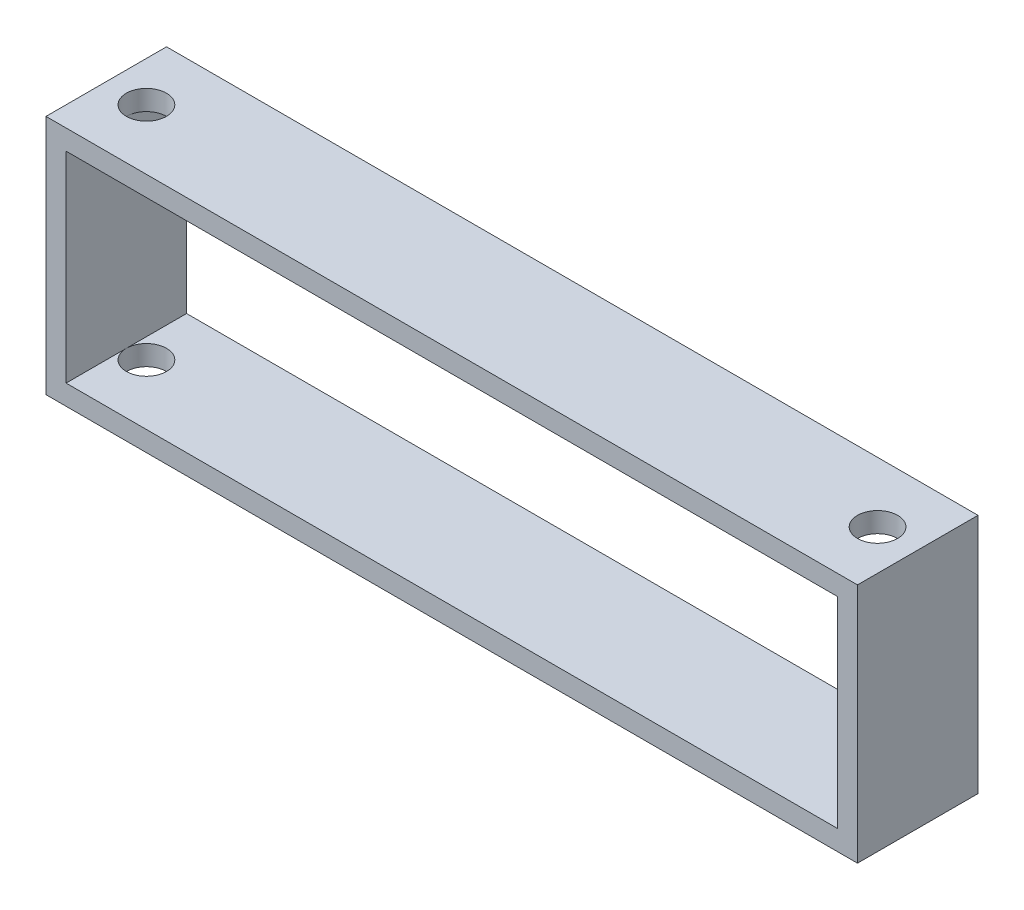
ISO-10303-21;
HEADER;
FILE_DESCRIPTION(('STEP AP214'),'2;1');
FILE_NAME('part.step','',(''),(''),'','','');
FILE_SCHEMA(('AUTOMOTIVE_DESIGN { 1 0 10303 214 1 1 1 1 }'));
ENDSEC;
DATA;
#1=APPLICATION_CONTEXT('core data for automotive mechanical design processes');
#2=APPLICATION_PROTOCOL_DEFINITION('international standard','automotive_design',2000,#1);
#3=PRODUCT_CONTEXT('',#1,'mechanical');
#4=PRODUCT('Part','Part','',(#3));
#5=PRODUCT_RELATED_PRODUCT_CATEGORY('part','',(#4));
#6=PRODUCT_DEFINITION_FORMATION('','',#4);
#7=PRODUCT_DEFINITION_CONTEXT('part definition',#1,'design');
#8=PRODUCT_DEFINITION('design','',#6,#7);
#9=PRODUCT_DEFINITION_SHAPE('','',#8);
#10=(LENGTH_UNIT() NAMED_UNIT(*) SI_UNIT(.MILLI.,.METRE.));
#11=(NAMED_UNIT(*) PLANE_ANGLE_UNIT() SI_UNIT($,.RADIAN.));
#12=(NAMED_UNIT(*) SI_UNIT($,.STERADIAN.) SOLID_ANGLE_UNIT());
#13=UNCERTAINTY_MEASURE_WITH_UNIT(LENGTH_MEASURE(1.E-05),#10,'distance_accuracy_value','');
#14=(GEOMETRIC_REPRESENTATION_CONTEXT(3) GLOBAL_UNCERTAINTY_ASSIGNED_CONTEXT((#13)) GLOBAL_UNIT_ASSIGNED_CONTEXT((#10,
#11,#12)) REPRESENTATION_CONTEXT('',''));
#15=CARTESIAN_POINT('',(0.,0.,0.));
#16=DIRECTION('',(0.,0.,1.));
#17=DIRECTION('',(1.,0.,0.));
#18=AXIS2_PLACEMENT_3D('',#15,#16,#17);
#19=CARTESIAN_POINT('',(-37.062063557265,60.,-4.0983606557377));
#20=DIRECTION('',(0.,-1.,0.));
#21=DIRECTION('',(0.,0.,-1.));
#22=AXIS2_PLACEMENT_3D('',#19,#20,#21);
#23=CYLINDRICAL_SURFACE('',#22,5.);
#24=CARTESIAN_POINT('',(-37.062063557265,55.,-4.0983606557377));
#25=DIRECTION('',(0.,1.,0.));
#26=DIRECTION('',(0.,0.,1.));
#27=AXIS2_PLACEMENT_3D('',#24,#25,#26);
#28=CIRCLE('',#27,5.);
#29=CARTESIAN_POINT('',(-42.062063557265,55.,-4.0983606557377));
#30=VERTEX_POINT('',#29);
#31=EDGE_CURVE('E157',#30,#30,#28,.T.);
#32=ORIENTED_EDGE('',*,*,#31,.F.);
#33=EDGE_LOOP('',(#32));
#34=FACE_BOUND('',#33,.T.);
#35=CARTESIAN_POINT('',(-37.062063557265,60.,-4.0983606557377));
#36=DIRECTION('',(0.,1.,0.));
#37=DIRECTION('',(0.,0.,1.));
#38=AXIS2_PLACEMENT_3D('',#35,#36,#37);
#39=CIRCLE('',#38,5.);
#40=CARTESIAN_POINT('',(-37.062063557265,60.,0.901639344262295));
#41=VERTEX_POINT('',#40);
#42=EDGE_CURVE('E167',#41,#41,#39,.T.);
#43=ORIENTED_EDGE('',*,*,#42,.T.);
#44=EDGE_LOOP('',(#43));
#45=FACE_BOUND('',#44,.T.);
#46=ADVANCED_FACE('F36',(#34,#45),#23,.F.);
#47=CARTESIAN_POINT('',(144.937936442735,60.,-4.0983606557377));
#48=DIRECTION('',(0.,-1.,0.));
#49=DIRECTION('',(0.,0.,-1.));
#50=AXIS2_PLACEMENT_3D('',#47,#48,#49);
#51=CYLINDRICAL_SURFACE('',#50,5.00000000000002);
#52=CARTESIAN_POINT('',(144.937936442735,55.,-4.0983606557377));
#53=DIRECTION('',(0.,1.,0.));
#54=DIRECTION('',(0.,0.,1.));
#55=AXIS2_PLACEMENT_3D('',#52,#53,#54);
#56=CIRCLE('',#55,5.00000000000002);
#57=CARTESIAN_POINT('',(149.937936442735,55.,-4.0983606557377));
#58=VERTEX_POINT('',#57);
#59=EDGE_CURVE('E11',#58,#58,#56,.T.);
#60=ORIENTED_EDGE('',*,*,#59,.F.);
#61=EDGE_LOOP('',(#60));
#62=FACE_BOUND('',#61,.T.);
#63=CARTESIAN_POINT('',(144.937936442735,60.,-4.0983606557377));
#64=DIRECTION('',(0.,1.,0.));
#65=DIRECTION('',(0.,0.,1.));
#66=AXIS2_PLACEMENT_3D('',#63,#64,#65);
#67=CIRCLE('',#66,5.00000000000002);
#68=CARTESIAN_POINT('',(144.937936442735,60.,0.901639344262315));
#69=VERTEX_POINT('',#68);
#70=EDGE_CURVE('E161',#69,#69,#67,.T.);
#71=ORIENTED_EDGE('',*,*,#70,.T.);
#72=EDGE_LOOP('',(#71));
#73=FACE_BOUND('',#72,.T.);
#74=ADVANCED_FACE('F209',(#62,#73),#51,.F.);
#75=CARTESIAN_POINT('',(0.,60.,0.));
#76=DIRECTION('',(0.,-1.,0.));
#77=DIRECTION('',(0.,0.,-1.));
#78=AXIS2_PLACEMENT_3D('',#75,#76,#77);
#79=PLANE('',#78);
#80=DIRECTION('',(0.,0.,1.));
#81=VECTOR('',#80,1.);
#82=CARTESIAN_POINT('',(-47.062063557265,60.,10.9016393442623));
#83=LINE('',#82,#81);
#84=CARTESIAN_POINT('',(-47.062063557265,60.,-19.0983606557377));
#85=VERTEX_POINT('',#84);
#86=CARTESIAN_POINT('',(-47.062063557265,60.,10.9016393442623));
#87=VERTEX_POINT('',#86);
#88=EDGE_CURVE('E173',#85,#87,#83,.T.);
#89=ORIENTED_EDGE('',*,*,#88,.T.);
#90=DIRECTION('',(1.,0.,0.));
#91=VECTOR('',#90,1.);
#92=CARTESIAN_POINT('',(-47.062063557265,60.,10.9016393442623));
#93=LINE('',#92,#91);
#94=CARTESIAN_POINT('',(154.937936442735,60.,10.9016393442623));
#95=VERTEX_POINT('',#94);
#96=EDGE_CURVE('E176',#87,#95,#93,.T.);
#97=ORIENTED_EDGE('',*,*,#96,.T.);
#98=DIRECTION('',(0.,0.,-1.));
#99=VECTOR('',#98,1.);
#100=CARTESIAN_POINT('',(154.937936442735,60.,10.9016393442623));
#101=LINE('',#100,#99);
#102=CARTESIAN_POINT('',(154.937936442735,60.,-19.0983606557377));
#103=VERTEX_POINT('',#102);
#104=EDGE_CURVE('E179',#95,#103,#101,.T.);
#105=ORIENTED_EDGE('',*,*,#104,.T.);
#106=DIRECTION('',(-1.,0.,0.));
#107=VECTOR('',#106,1.);
#108=CARTESIAN_POINT('',(-47.062063557265,60.,-19.0983606557377));
#109=LINE('',#108,#107);
#110=EDGE_CURVE('E181',#103,#85,#109,.T.);
#111=ORIENTED_EDGE('',*,*,#110,.T.);
#112=EDGE_LOOP('',(#89,#97,#105,#111));
#113=FACE_BOUND('',#112,.T.);
#114=ORIENTED_EDGE('',*,*,#42,.F.);
#115=EDGE_LOOP('',(#114));
#116=FACE_BOUND('',#115,.T.);
#117=ORIENTED_EDGE('',*,*,#70,.F.);
#118=EDGE_LOOP('',(#117));
#119=FACE_BOUND('',#118,.T.);
#120=ADVANCED_FACE('F214',(#113,#116,#119),#79,.F.);
#121=CARTESIAN_POINT('',(0.,0.,0.));
#122=DIRECTION('',(0.,-1.,0.));
#123=DIRECTION('',(0.,0.,-1.));
#124=AXIS2_PLACEMENT_3D('',#121,#122,#123);
#125=PLANE('',#124);
#126=CARTESIAN_POINT('',(-37.062063557265,0.,-4.0983606557377));
#127=DIRECTION('',(0.,1.,0.));
#128=DIRECTION('',(0.,0.,1.));
#129=AXIS2_PLACEMENT_3D('',#126,#127,#128);
#130=CIRCLE('',#129,5.);
#131=CARTESIAN_POINT('',(-37.062063557265,0.,0.901639344262295));
#132=VERTEX_POINT('',#131);
#133=EDGE_CURVE('E164',#132,#132,#130,.T.);
#134=ORIENTED_EDGE('',*,*,#133,.T.);
#135=EDGE_LOOP('',(#134));
#136=FACE_BOUND('',#135,.T.);
#137=DIRECTION('',(0.,0.,1.));
#138=VECTOR('',#137,1.);
#139=CARTESIAN_POINT('',(-47.062063557265,0.,10.9016393442623));
#140=LINE('',#139,#138);
#141=CARTESIAN_POINT('',(-47.062063557265,0.,-19.0983606557377));
#142=VERTEX_POINT('',#141);
#143=CARTESIAN_POINT('',(-47.062063557265,0.,10.9016393442623));
#144=VERTEX_POINT('',#143);
#145=EDGE_CURVE('E170',#142,#144,#140,.T.);
#146=ORIENTED_EDGE('',*,*,#145,.F.);
#147=DIRECTION('',(-1.,0.,0.));
#148=VECTOR('',#147,1.);
#149=CARTESIAN_POINT('',(-47.062063557265,0.,-19.0983606557377));
#150=LINE('',#149,#148);
#151=CARTESIAN_POINT('',(154.937936442735,0.,-19.0983606557377));
#152=VERTEX_POINT('',#151);
#153=EDGE_CURVE('E177',#152,#142,#150,.T.);
#154=ORIENTED_EDGE('',*,*,#153,.F.);
#155=DIRECTION('',(0.,0.,-1.));
#156=VECTOR('',#155,1.);
#157=CARTESIAN_POINT('',(154.937936442735,0.,10.9016393442623));
#158=LINE('',#157,#156);
#159=CARTESIAN_POINT('',(154.937936442735,0.,10.9016393442623));
#160=VERTEX_POINT('',#159);
#161=EDGE_CURVE('E188',#160,#152,#158,.T.);
#162=ORIENTED_EDGE('',*,*,#161,.F.);
#163=DIRECTION('',(1.,0.,0.));
#164=VECTOR('',#163,1.);
#165=CARTESIAN_POINT('',(-47.062063557265,0.,10.9016393442623));
#166=LINE('',#165,#164);
#167=EDGE_CURVE('E186',#144,#160,#166,.T.);
#168=ORIENTED_EDGE('',*,*,#167,.F.);
#169=EDGE_LOOP('',(#146,#154,#162,#168));
#170=FACE_BOUND('',#169,.T.);
#171=CARTESIAN_POINT('',(144.937936442735,0.,-4.0983606557377));
#172=DIRECTION('',(0.,1.,0.));
#173=DIRECTION('',(0.,0.,1.));
#174=AXIS2_PLACEMENT_3D('',#171,#172,#173);
#175=CIRCLE('',#174,5.00000000000002);
#176=CARTESIAN_POINT('',(144.937936442735,0.,0.901639344262315));
#177=VERTEX_POINT('',#176);
#178=EDGE_CURVE('E160',#177,#177,#175,.T.);
#179=ORIENTED_EDGE('',*,*,#178,.T.);
#180=EDGE_LOOP('',(#179));
#181=FACE_BOUND('',#180,.T.);
#182=ADVANCED_FACE('F212',(#136,#170,#181),#125,.T.);
#183=CARTESIAN_POINT('',(-47.062063557265,60.,10.9016393442623));
#184=DIRECTION('',(1.,0.,0.));
#185=DIRECTION('',(0.,0.,-1.));
#186=AXIS2_PLACEMENT_3D('',#183,#184,#185);
#187=PLANE('',#186);
#188=ORIENTED_EDGE('',*,*,#145,.T.);
#189=DIRECTION('',(0.,-1.,0.));
#190=VECTOR('',#189,1.);
#191=CARTESIAN_POINT('',(-47.062063557265,60.,10.9016393442623));
#192=LINE('',#191,#190);
#193=EDGE_CURVE('E199',#87,#144,#192,.T.);
#194=ORIENTED_EDGE('',*,*,#193,.F.);
#195=ORIENTED_EDGE('',*,*,#88,.F.);
#196=DIRECTION('',(0.,-1.,0.));
#197=VECTOR('',#196,1.);
#198=CARTESIAN_POINT('',(-47.062063557265,60.,-19.0983606557377));
#199=LINE('',#198,#197);
#200=EDGE_CURVE('E183',#85,#142,#199,.T.);
#201=ORIENTED_EDGE('',*,*,#200,.T.);
#202=EDGE_LOOP('',(#188,#194,#195,#201));
#203=FACE_BOUND('',#202,.T.);
#204=ADVANCED_FACE('F38',(#203),#187,.F.);
#205=CARTESIAN_POINT('',(-47.062063557265,60.,10.9016393442623));
#206=DIRECTION('',(0.,0.,-1.));
#207=DIRECTION('',(-1.,0.,0.));
#208=AXIS2_PLACEMENT_3D('',#205,#206,#207);
#209=PLANE('',#208);
#210=DIRECTION('',(1.,0.,0.));
#211=VECTOR('',#210,1.);
#212=CARTESIAN_POINT('',(-42.062063557265,5.,10.9016393442623));
#213=LINE('',#212,#211);
#214=CARTESIAN_POINT('',(-42.062063557265,5.,10.9016393442623));
#215=VERTEX_POINT('',#214);
#216=CARTESIAN_POINT('',(149.937936442735,5.,10.9016393442623));
#217=VERTEX_POINT('',#216);
#218=EDGE_CURVE('E143',#215,#217,#213,.T.);
#219=ORIENTED_EDGE('',*,*,#218,.F.);
#220=DIRECTION('',(0.,-1.,0.));
#221=VECTOR('',#220,1.);
#222=CARTESIAN_POINT('',(-42.062063557265,55.,10.9016393442623));
#223=LINE('',#222,#221);
#224=CARTESIAN_POINT('',(-42.062063557265,55.,10.9016393442623));
#225=VERTEX_POINT('',#224);
#226=EDGE_CURVE('E51',#225,#215,#223,.T.);
#227=ORIENTED_EDGE('',*,*,#226,.F.);
#228=DIRECTION('',(-1.,0.,0.));
#229=VECTOR('',#228,1.);
#230=CARTESIAN_POINT('',(-42.062063557265,55.,10.9016393442623));
#231=LINE('',#230,#229);
#232=CARTESIAN_POINT('',(149.937936442735,55.,10.9016393442623));
#233=VERTEX_POINT('',#232);
#234=EDGE_CURVE('E134',#233,#225,#231,.T.);
#235=ORIENTED_EDGE('',*,*,#234,.F.);
#236=DIRECTION('',(0.,1.,0.));
#237=VECTOR('',#236,1.);
#238=CARTESIAN_POINT('',(149.937936442735,55.,10.9016393442623));
#239=LINE('',#238,#237);
#240=EDGE_CURVE('E137',#217,#233,#239,.T.);
#241=ORIENTED_EDGE('',*,*,#240,.F.);
#242=EDGE_LOOP('',(#219,#227,#235,#241));
#243=FACE_BOUND('',#242,.T.);
#244=ORIENTED_EDGE('',*,*,#167,.T.);
#245=DIRECTION('',(0.,-1.,0.));
#246=VECTOR('',#245,1.);
#247=CARTESIAN_POINT('',(154.937936442735,60.,10.9016393442623));
#248=LINE('',#247,#246);
#249=EDGE_CURVE('E196',#95,#160,#248,.T.);
#250=ORIENTED_EDGE('',*,*,#249,.F.);
#251=ORIENTED_EDGE('',*,*,#96,.F.);
#252=ORIENTED_EDGE('',*,*,#193,.T.);
#253=EDGE_LOOP('',(#244,#250,#251,#252));
#254=FACE_BOUND('',#253,.T.);
#255=ADVANCED_FACE('F221',(#243,#254),#209,.F.);
#256=CARTESIAN_POINT('',(154.937936442735,60.,10.9016393442623));
#257=DIRECTION('',(-1.,0.,0.));
#258=DIRECTION('',(0.,0.,1.));
#259=AXIS2_PLACEMENT_3D('',#256,#257,#258);
#260=PLANE('',#259);
#261=ORIENTED_EDGE('',*,*,#161,.T.);
#262=DIRECTION('',(0.,-1.,0.));
#263=VECTOR('',#262,1.);
#264=CARTESIAN_POINT('',(154.937936442735,60.,-19.0983606557377));
#265=LINE('',#264,#263);
#266=EDGE_CURVE('E193',#103,#152,#265,.T.);
#267=ORIENTED_EDGE('',*,*,#266,.F.);
#268=ORIENTED_EDGE('',*,*,#104,.F.);
#269=ORIENTED_EDGE('',*,*,#249,.T.);
#270=EDGE_LOOP('',(#261,#267,#268,#269));
#271=FACE_BOUND('',#270,.T.);
#272=ADVANCED_FACE('F241',(#271),#260,.F.);
#273=CARTESIAN_POINT('',(-47.062063557265,60.,-19.0983606557377));
#274=DIRECTION('',(0.,0.,1.));
#275=DIRECTION('',(1.,0.,0.));
#276=AXIS2_PLACEMENT_3D('',#273,#274,#275);
#277=PLANE('',#276);
#278=DIRECTION('',(-1.,0.,0.));
#279=VECTOR('',#278,1.);
#280=CARTESIAN_POINT('',(-42.062063557265,55.,-19.0983606557377));
#281=LINE('',#280,#279);
#282=CARTESIAN_POINT('',(149.937936442735,55.,-19.0983606557377));
#283=VERTEX_POINT('',#282);
#284=CARTESIAN_POINT('',(-42.062063557265,55.,-19.0983606557377));
#285=VERTEX_POINT('',#284);
#286=EDGE_CURVE('E133',#283,#285,#281,.T.);
#287=ORIENTED_EDGE('',*,*,#286,.T.);
#288=DIRECTION('',(0.,-1.,0.));
#289=VECTOR('',#288,1.);
#290=CARTESIAN_POINT('',(-42.062063557265,55.,-19.0983606557377));
#291=LINE('',#290,#289);
#292=CARTESIAN_POINT('',(-42.062063557265,5.,-19.0983606557377));
#293=VERTEX_POINT('',#292);
#294=EDGE_CURVE('E116',#285,#293,#291,.T.);
#295=ORIENTED_EDGE('',*,*,#294,.T.);
#296=DIRECTION('',(1.,0.,0.));
#297=VECTOR('',#296,1.);
#298=CARTESIAN_POINT('',(-42.062063557265,5.,-19.0983606557377));
#299=LINE('',#298,#297);
#300=CARTESIAN_POINT('',(149.937936442735,5.,-19.0983606557377));
#301=VERTEX_POINT('',#300);
#302=EDGE_CURVE('E124',#293,#301,#299,.T.);
#303=ORIENTED_EDGE('',*,*,#302,.T.);
#304=DIRECTION('',(0.,1.,0.));
#305=VECTOR('',#304,1.);
#306=CARTESIAN_POINT('',(149.937936442735,55.,-19.0983606557377));
#307=LINE('',#306,#305);
#308=EDGE_CURVE('E59',#301,#283,#307,.T.);
#309=ORIENTED_EDGE('',*,*,#308,.T.);
#310=EDGE_LOOP('',(#287,#295,#303,#309));
#311=FACE_BOUND('',#310,.T.);
#312=ORIENTED_EDGE('',*,*,#153,.T.);
#313=ORIENTED_EDGE('',*,*,#200,.F.);
#314=ORIENTED_EDGE('',*,*,#110,.F.);
#315=ORIENTED_EDGE('',*,*,#266,.T.);
#316=EDGE_LOOP('',(#312,#313,#314,#315));
#317=FACE_BOUND('',#316,.T.);
#318=ADVANCED_FACE('F130',(#311,#317),#277,.F.);
#319=CARTESIAN_POINT('',(-37.062063557265,5.,-4.0983606557377));
#320=DIRECTION('',(0.,-1.,0.));
#321=DIRECTION('',(0.,0.,-1.));
#322=AXIS2_PLACEMENT_3D('',#319,#320,#321);
#323=CIRCLE('',#322,5.);
#324=CARTESIAN_POINT('',(-42.062063557265,5.,-4.0983606557377));
#325=VERTEX_POINT('',#324);
#326=EDGE_CURVE('E150',#325,#325,#323,.T.);
#327=ORIENTED_EDGE('',*,*,#326,.F.);
#328=EDGE_LOOP('',(#327));
#329=FACE_BOUND('',#328,.T.);
#330=ORIENTED_EDGE('',*,*,#133,.F.);
#331=EDGE_LOOP('',(#330));
#332=FACE_BOUND('',#331,.T.);
#333=ADVANCED_FACE('F207',(#329,#332),#23,.F.);
#334=CARTESIAN_POINT('',(144.937936442735,5.,-4.0983606557377));
#335=DIRECTION('',(0.,-1.,0.));
#336=DIRECTION('',(0.,0.,-1.));
#337=AXIS2_PLACEMENT_3D('',#334,#335,#336);
#338=CIRCLE('',#337,5.00000000000002);
#339=CARTESIAN_POINT('',(149.937936442735,5.,-4.0983606557377));
#340=VERTEX_POINT('',#339);
#341=EDGE_CURVE('E44',#340,#340,#338,.T.);
#342=ORIENTED_EDGE('',*,*,#341,.F.);
#343=EDGE_LOOP('',(#342));
#344=FACE_BOUND('',#343,.T.);
#345=ORIENTED_EDGE('',*,*,#178,.F.);
#346=EDGE_LOOP('',(#345));
#347=FACE_BOUND('',#346,.T.);
#348=ADVANCED_FACE('F204',(#344,#347),#51,.F.);
#349=CARTESIAN_POINT('',(-42.062063557265,55.,-19.0983606557377));
#350=DIRECTION('',(-1.,0.,0.));
#351=DIRECTION('',(0.,-1.,0.));
#352=AXIS2_PLACEMENT_3D('',#349,#350,#351);
#353=PLANE('',#352);
#354=DIRECTION('',(0.,0.,1.));
#355=VECTOR('',#354,1.);
#356=CARTESIAN_POINT('',(-42.062063557265,55.,-19.0983606557377));
#357=LINE('',#356,#355);
#358=EDGE_CURVE('E151',#30,#225,#357,.T.);
#359=ORIENTED_EDGE('',*,*,#358,.T.);
#360=ORIENTED_EDGE('',*,*,#226,.T.);
#361=DIRECTION('',(0.,0.,1.));
#362=VECTOR('',#361,1.);
#363=CARTESIAN_POINT('',(-42.062063557265,5.,-19.0983606557377));
#364=LINE('',#363,#362);
#365=EDGE_CURVE('E118',#325,#215,#364,.T.);
#366=ORIENTED_EDGE('',*,*,#365,.F.);
#367=EDGE_CURVE('E112',#293,#325,#364,.T.);
#368=ORIENTED_EDGE('',*,*,#367,.F.);
#369=ORIENTED_EDGE('',*,*,#294,.F.);
#370=EDGE_CURVE('E148',#285,#30,#357,.T.);
#371=ORIENTED_EDGE('',*,*,#370,.T.);
#372=EDGE_LOOP('',(#359,#360,#366,#368,#369,#371));
#373=FACE_BOUND('',#372,.T.);
#374=ADVANCED_FACE('F114',(#373),#353,.F.);
#375=CARTESIAN_POINT('',(149.937936442735,55.,-19.0983606557377));
#376=DIRECTION('',(1.,0.,0.));
#377=DIRECTION('',(0.,0.,-1.));
#378=AXIS2_PLACEMENT_3D('',#375,#376,#377);
#379=PLANE('',#378);
#380=DIRECTION('',(0.,0.,1.));
#381=VECTOR('',#380,1.);
#382=CARTESIAN_POINT('',(149.937936442735,55.,-19.0983606557377));
#383=LINE('',#382,#381);
#384=EDGE_CURVE('E152',#283,#58,#383,.T.);
#385=ORIENTED_EDGE('',*,*,#384,.F.);
#386=ORIENTED_EDGE('',*,*,#308,.F.);
#387=DIRECTION('',(0.,0.,1.));
#388=VECTOR('',#387,1.);
#389=CARTESIAN_POINT('',(149.937936442735,5.,-19.0983606557377));
#390=LINE('',#389,#388);
#391=EDGE_CURVE('E127',#301,#340,#390,.T.);
#392=ORIENTED_EDGE('',*,*,#391,.T.);
#393=EDGE_CURVE('E121',#340,#217,#390,.T.);
#394=ORIENTED_EDGE('',*,*,#393,.T.);
#395=ORIENTED_EDGE('',*,*,#240,.T.);
#396=EDGE_CURVE('E154',#58,#233,#383,.T.);
#397=ORIENTED_EDGE('',*,*,#396,.F.);
#398=EDGE_LOOP('',(#385,#386,#392,#394,#395,#397));
#399=FACE_BOUND('',#398,.T.);
#400=ADVANCED_FACE('F251',(#399),#379,.F.);
#401=CARTESIAN_POINT('',(-42.062063557265,55.,-19.0983606557377));
#402=DIRECTION('',(0.,1.,0.));
#403=DIRECTION('',(0.,0.,1.));
#404=AXIS2_PLACEMENT_3D('',#401,#402,#403);
#405=PLANE('',#404);
#406=ORIENTED_EDGE('',*,*,#370,.F.);
#407=ORIENTED_EDGE('',*,*,#286,.F.);
#408=ORIENTED_EDGE('',*,*,#384,.T.);
#409=ORIENTED_EDGE('',*,*,#59,.T.);
#410=ORIENTED_EDGE('',*,*,#396,.T.);
#411=ORIENTED_EDGE('',*,*,#234,.T.);
#412=ORIENTED_EDGE('',*,*,#358,.F.);
#413=ORIENTED_EDGE('',*,*,#31,.T.);
#414=EDGE_LOOP('',(#406,#407,#408,#409,#410,#411,#412,#413));
#415=FACE_BOUND('',#414,.T.);
#416=ADVANCED_FACE('F254',(#415),#405,.F.);
#417=CARTESIAN_POINT('',(-42.062063557265,5.,-19.0983606557377));
#418=DIRECTION('',(0.,-1.,0.));
#419=DIRECTION('',(0.,0.,-1.));
#420=AXIS2_PLACEMENT_3D('',#417,#418,#419);
#421=PLANE('',#420);
#422=ORIENTED_EDGE('',*,*,#365,.T.);
#423=ORIENTED_EDGE('',*,*,#218,.T.);
#424=ORIENTED_EDGE('',*,*,#393,.F.);
#425=ORIENTED_EDGE('',*,*,#341,.T.);
#426=ORIENTED_EDGE('',*,*,#391,.F.);
#427=ORIENTED_EDGE('',*,*,#302,.F.);
#428=ORIENTED_EDGE('',*,*,#367,.T.);
#429=ORIENTED_EDGE('',*,*,#326,.T.);
#430=EDGE_LOOP('',(#422,#423,#424,#425,#426,#427,#428,#429));
#431=FACE_BOUND('',#430,.T.);
#432=ADVANCED_FACE('F125',(#431),#421,.F.);
#433=CLOSED_SHELL('',(#46,#74,#120,#182,#204,#255,#272,#318,#333,#348,#374,#400,#416,#432));
#434=MANIFOLD_SOLID_BREP('B2',#433);
#435=ADVANCED_BREP_SHAPE_REPRESENTATION('',(#18,#434),#14);
#436=SHAPE_DEFINITION_REPRESENTATION(#9,#435);
ENDSEC;
END-ISO-10303-21;
